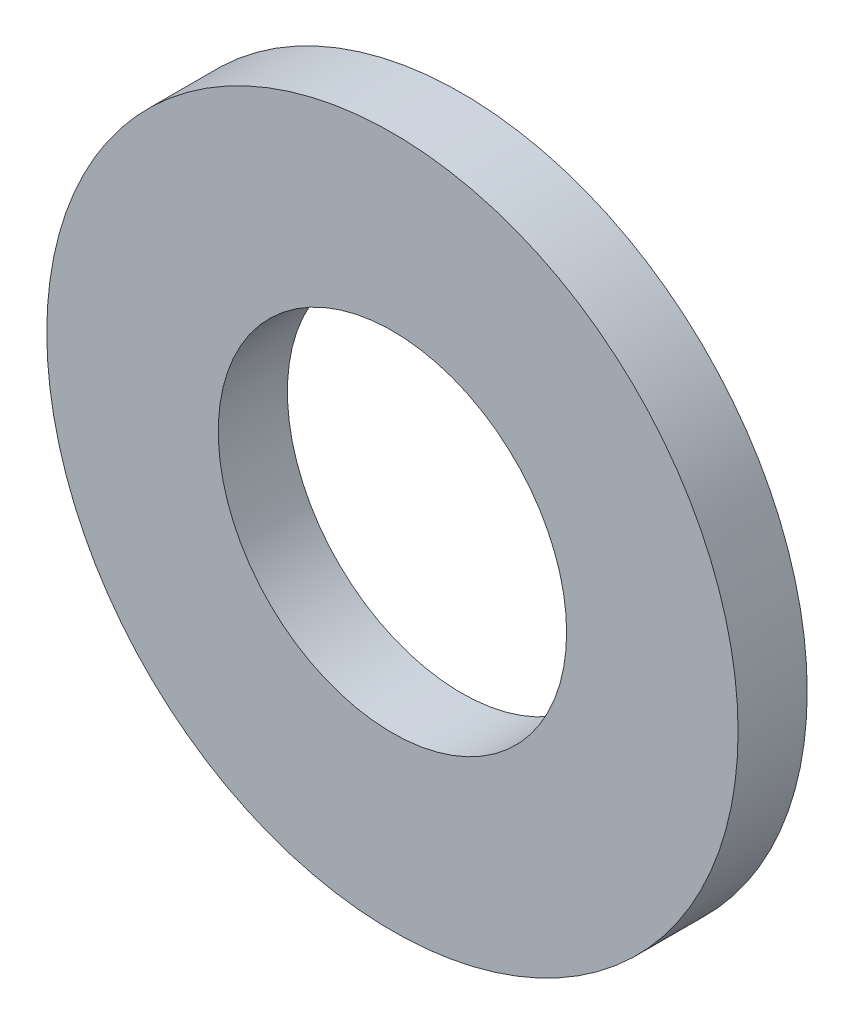
ISO-10303-21;
HEADER;
FILE_DESCRIPTION(('STEP AP214'),'2;1');
FILE_NAME('part.step','',(''),(''),'','','');
FILE_SCHEMA(('AUTOMOTIVE_DESIGN { 1 0 10303 214 1 1 1 1 }'));
ENDSEC;
DATA;
#1=APPLICATION_CONTEXT('core data for automotive mechanical design processes');
#2=APPLICATION_PROTOCOL_DEFINITION('international standard','automotive_design',2000,#1);
#3=PRODUCT_CONTEXT('',#1,'mechanical');
#4=PRODUCT('Part','Part','',(#3));
#5=PRODUCT_RELATED_PRODUCT_CATEGORY('part','',(#4));
#6=PRODUCT_DEFINITION_FORMATION('','',#4);
#7=PRODUCT_DEFINITION_CONTEXT('part definition',#1,'design');
#8=PRODUCT_DEFINITION('design','',#6,#7);
#9=PRODUCT_DEFINITION_SHAPE('','',#8);
#10=(LENGTH_UNIT() NAMED_UNIT(*) SI_UNIT(.MILLI.,.METRE.));
#11=(NAMED_UNIT(*) PLANE_ANGLE_UNIT() SI_UNIT($,.RADIAN.));
#12=(NAMED_UNIT(*) SI_UNIT($,.STERADIAN.) SOLID_ANGLE_UNIT());
#13=UNCERTAINTY_MEASURE_WITH_UNIT(LENGTH_MEASURE(1.E-05),#10,'distance_accuracy_value','');
#14=(GEOMETRIC_REPRESENTATION_CONTEXT(3) GLOBAL_UNCERTAINTY_ASSIGNED_CONTEXT((#13)) GLOBAL_UNIT_ASSIGNED_CONTEXT((#10,
#11,#12)) REPRESENTATION_CONTEXT('',''));
#15=CARTESIAN_POINT('',(0.,0.,0.));
#16=DIRECTION('',(0.,0.,1.));
#17=DIRECTION('',(1.,0.,0.));
#18=AXIS2_PLACEMENT_3D('',#15,#16,#17);
#19=CARTESIAN_POINT('',(0.,0.,1.5875));
#20=DIRECTION('',(0.,0.,1.));
#21=DIRECTION('',(1.,0.,0.));
#22=AXIS2_PLACEMENT_3D('',#19,#20,#21);
#23=PLANE('',#22);
#24=CARTESIAN_POINT('',(0.,0.,1.5875));
#25=DIRECTION('',(0.,0.,1.));
#26=DIRECTION('',(1.,0.,0.));
#27=AXIS2_PLACEMENT_3D('',#24,#25,#26);
#28=CIRCLE('',#27,7.9375);
#29=CARTESIAN_POINT('',(7.9375,0.,1.5875));
#30=VERTEX_POINT('',#29);
#31=EDGE_CURVE('E10',#30,#30,#28,.T.);
#32=ORIENTED_EDGE('',*,*,#31,.T.);
#33=EDGE_LOOP('',(#32));
#34=FACE_BOUND('',#33,.T.);
#35=CARTESIAN_POINT('',(0.,0.,1.5875));
#36=DIRECTION('',(0.,0.,1.));
#37=DIRECTION('',(1.,0.,0.));
#38=AXIS2_PLACEMENT_3D('',#35,#36,#37);
#39=CIRCLE('',#38,4.);
#40=CARTESIAN_POINT('',(4.,0.,1.5875));
#41=VERTEX_POINT('',#40);
#42=EDGE_CURVE('E56',#41,#41,#39,.T.);
#43=ORIENTED_EDGE('',*,*,#42,.F.);
#44=EDGE_LOOP('',(#43));
#45=FACE_BOUND('',#44,.T.);
#46=ADVANCED_FACE('F43',(#34,#45),#23,.T.);
#47=CARTESIAN_POINT('',(0.,0.,0.));
#48=DIRECTION('',(0.,0.,1.));
#49=DIRECTION('',(1.,0.,0.));
#50=AXIS2_PLACEMENT_3D('',#47,#48,#49);
#51=PLANE('',#50);
#52=CARTESIAN_POINT('',(0.,0.,0.));
#53=DIRECTION('',(0.,0.,1.));
#54=DIRECTION('',(1.,0.,0.));
#55=AXIS2_PLACEMENT_3D('',#52,#53,#54);
#56=CIRCLE('',#55,7.9375);
#57=CARTESIAN_POINT('',(7.9375,0.,0.));
#58=VERTEX_POINT('',#57);
#59=EDGE_CURVE('E47',#58,#58,#56,.T.);
#60=ORIENTED_EDGE('',*,*,#59,.F.);
#61=EDGE_LOOP('',(#60));
#62=FACE_BOUND('',#61,.T.);
#63=CARTESIAN_POINT('',(0.,0.,0.));
#64=DIRECTION('',(0.,0.,1.));
#65=DIRECTION('',(1.,0.,0.));
#66=AXIS2_PLACEMENT_3D('',#63,#64,#65);
#67=CIRCLE('',#66,4.);
#68=CARTESIAN_POINT('',(4.,0.,0.));
#69=VERTEX_POINT('',#68);
#70=EDGE_CURVE('E58',#69,#69,#67,.T.);
#71=ORIENTED_EDGE('',*,*,#70,.T.);
#72=EDGE_LOOP('',(#71));
#73=FACE_BOUND('',#72,.T.);
#74=ADVANCED_FACE('F70',(#62,#73),#51,.F.);
#75=CARTESIAN_POINT('',(0.,0.,1.5875));
#76=DIRECTION('',(0.,0.,-1.));
#77=DIRECTION('',(-1.,0.,0.));
#78=AXIS2_PLACEMENT_3D('',#75,#76,#77);
#79=CYLINDRICAL_SURFACE('',#78,7.9375);
#80=ORIENTED_EDGE('',*,*,#31,.F.);
#81=EDGE_LOOP('',(#80));
#82=FACE_BOUND('',#81,.T.);
#83=ORIENTED_EDGE('',*,*,#59,.T.);
#84=EDGE_LOOP('',(#83));
#85=FACE_BOUND('',#84,.T.);
#86=ADVANCED_FACE('F45',(#82,#85),#79,.T.);
#87=CARTESIAN_POINT('',(0.,0.,1.5875));
#88=DIRECTION('',(0.,0.,-1.));
#89=DIRECTION('',(-1.,0.,0.));
#90=AXIS2_PLACEMENT_3D('',#87,#88,#89);
#91=CYLINDRICAL_SURFACE('',#90,4.);
#92=ORIENTED_EDGE('',*,*,#42,.T.);
#93=EDGE_LOOP('',(#92));
#94=FACE_BOUND('',#93,.T.);
#95=ORIENTED_EDGE('',*,*,#70,.F.);
#96=EDGE_LOOP('',(#95));
#97=FACE_BOUND('',#96,.T.);
#98=ADVANCED_FACE('F66',(#94,#97),#91,.F.);
#99=CLOSED_SHELL('',(#46,#74,#86,#98));
#100=MANIFOLD_SOLID_BREP('B2',#99);
#101=ADVANCED_BREP_SHAPE_REPRESENTATION('',(#18,#100),#14);
#102=SHAPE_DEFINITION_REPRESENTATION(#9,#101);
ENDSEC;
END-ISO-10303-21;
